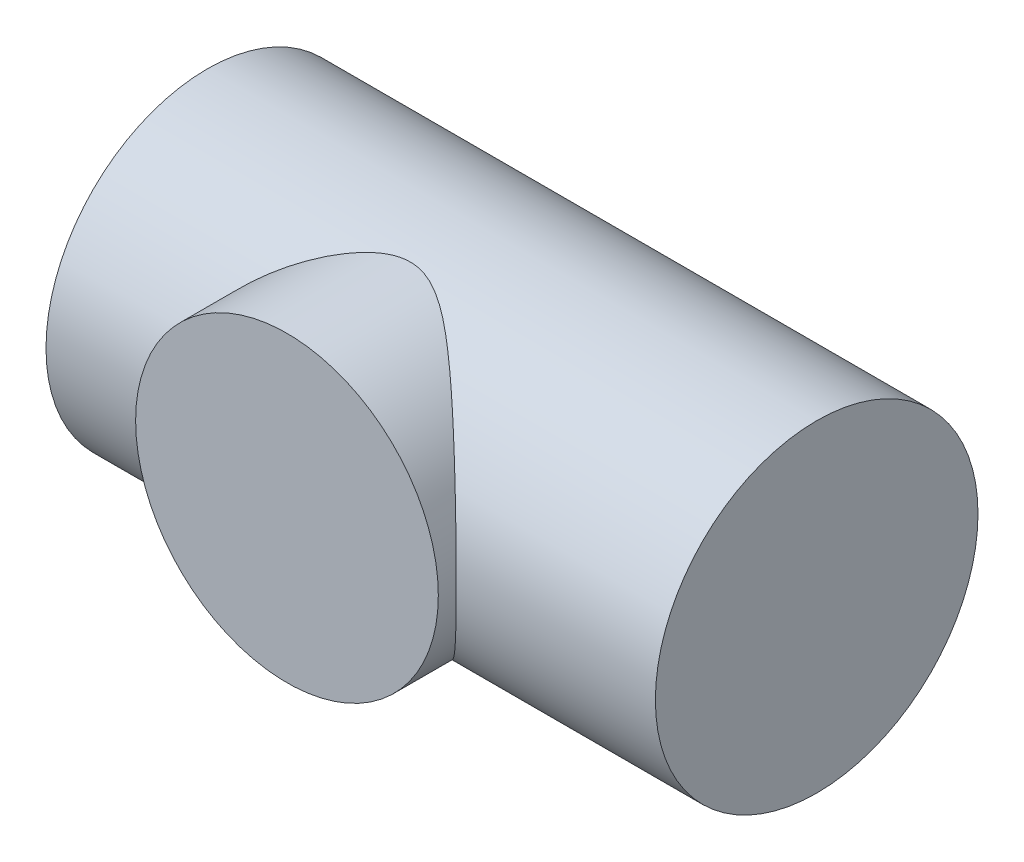
ISO-10303-21;
HEADER;
FILE_DESCRIPTION(('STEP AP214'),'2;1');
FILE_NAME('part.step','',(''),(''),'','','');
FILE_SCHEMA(('AUTOMOTIVE_DESIGN { 1 0 10303 214 1 1 1 1 }'));
ENDSEC;
DATA;
#1=APPLICATION_CONTEXT('core data for automotive mechanical design processes');
#2=APPLICATION_PROTOCOL_DEFINITION('international standard','automotive_design',2000,#1);
#3=PRODUCT_CONTEXT('',#1,'mechanical');
#4=PRODUCT('Part','Part','',(#3));
#5=PRODUCT_RELATED_PRODUCT_CATEGORY('part','',(#4));
#6=PRODUCT_DEFINITION_FORMATION('','',#4);
#7=PRODUCT_DEFINITION_CONTEXT('part definition',#1,'design');
#8=PRODUCT_DEFINITION('design','',#6,#7);
#9=PRODUCT_DEFINITION_SHAPE('','',#8);
#10=(LENGTH_UNIT() NAMED_UNIT(*) SI_UNIT(.MILLI.,.METRE.));
#11=(NAMED_UNIT(*) PLANE_ANGLE_UNIT() SI_UNIT($,.RADIAN.));
#12=(NAMED_UNIT(*) SI_UNIT($,.STERADIAN.) SOLID_ANGLE_UNIT());
#13=UNCERTAINTY_MEASURE_WITH_UNIT(LENGTH_MEASURE(1.E-05),#10,'distance_accuracy_value','');
#14=(GEOMETRIC_REPRESENTATION_CONTEXT(3) GLOBAL_UNCERTAINTY_ASSIGNED_CONTEXT((#13)) GLOBAL_UNIT_ASSIGNED_CONTEXT((#10,
#11,#12)) REPRESENTATION_CONTEXT('',''));
#15=CARTESIAN_POINT('',(0.,0.,0.));
#16=DIRECTION('',(0.,0.,1.));
#17=DIRECTION('',(1.,0.,0.));
#18=AXIS2_PLACEMENT_3D('',#15,#16,#17);
#19=CARTESIAN_POINT('',(0.088,0.,0.));
#20=DIRECTION('',(-1.,0.,0.));
#21=DIRECTION('',(0.,0.,1.));
#22=AXIS2_PLACEMENT_3D('',#19,#20,#21);
#23=CYLINDRICAL_SURFACE('',#22,0.0405);
#24=CARTESIAN_POINT('',(0.088,0.,0.));
#25=DIRECTION('',(1.,0.,0.));
#26=DIRECTION('',(0.,0.,-1.));
#27=AXIS2_PLACEMENT_3D('',#24,#25,#26);
#28=CIRCLE('',#27,0.0405);
#29=CARTESIAN_POINT('',(0.088,0.,-0.0405));
#30=VERTEX_POINT('',#29);
#31=EDGE_CURVE('E44',#30,#30,#28,.T.);
#32=ORIENTED_EDGE('',*,*,#31,.F.);
#33=EDGE_LOOP('',(#32));
#34=FACE_BOUND('',#33,.T.);
#35=CARTESIAN_POINT('',(-0.065,0.,0.));
#36=DIRECTION('',(1.,0.,0.));
#37=DIRECTION('',(0.,0.,-1.));
#38=AXIS2_PLACEMENT_3D('',#35,#36,#37);
#39=CIRCLE('',#38,0.0405);
#40=CARTESIAN_POINT('',(-0.065,0.,-0.0405));
#41=VERTEX_POINT('',#40);
#42=EDGE_CURVE('E48',#41,#41,#39,.T.);
#43=ORIENTED_EDGE('',*,*,#42,.T.);
#44=EDGE_LOOP('',(#43));
#45=FACE_BOUND('',#44,.T.);
#46=CARTESIAN_POINT('',(0.038,0.,0.0405));
#47=CARTESIAN_POINT('',(0.0379998436056929,0.00173464531378994,0.040499844851322));
#48=CARTESIAN_POINT('',(0.0378801601071881,0.00347117666066099,0.040387492347376));
#49=CARTESIAN_POINT('',(0.0374108064132313,0.00688596600961166,0.0399476160504583));
#50=CARTESIAN_POINT('',(0.0370607339762275,0.00856411667838719,0.0396197159289107));
#51=CARTESIAN_POINT('',(0.036159543315923,0.0118023042819811,0.0387780455508259));
#52=CARTESIAN_POINT('',(0.0356097875673089,0.0133630571319026,0.0382655351153598));
#53=CARTESIAN_POINT('',(0.0343410122253715,0.0163503339420385,0.037087728867139));
#54=CARTESIAN_POINT('',(0.0336219835968048,0.0177768507314715,0.0364224248988021));
#55=CARTESIAN_POINT('',(0.0317248797975061,0.0210328242274146,0.0346774764992745));
#56=CARTESIAN_POINT('',(0.0304788743861143,0.0227912134517076,0.0335391960272855));
#57=CARTESIAN_POINT('',(0.0277767955693511,0.0260173627252535,0.031103847065006));
#58=CARTESIAN_POINT('',(0.0263200373775349,0.0274841368639557,0.0298062631247067));
#59=CARTESIAN_POINT('',(0.0228192002680085,0.0304955650312954,0.0267589667813905));
#60=CARTESIAN_POINT('',(0.0207233838048813,0.0319520579169702,0.0249825682394132));
#61=CARTESIAN_POINT('',(0.0162862155182044,0.0344278271964056,0.021436302920104));
#62=CARTESIAN_POINT('',(0.013945589038381,0.0354483520551457,0.0196664320772224));
#63=CARTESIAN_POINT('',(0.0105433917269998,0.0365193449985406,0.0175211689946979));
#64=CARTESIAN_POINT('',(0.00964350189634389,0.0367683356018215,0.0169892730804365));
#65=CARTESIAN_POINT('',(0.00778538189350438,0.0372062141039362,0.0160071815891125));
#66=CARTESIAN_POINT('',(0.00682721569936953,0.0373951665450588,0.0155568985018543));
#67=CARTESIAN_POINT('',(0.00505242146494678,0.0376709355540498,0.0148747683780991));
#68=CARTESIAN_POINT('',(0.00424818581218965,0.0377708555757698,0.0146169231175633));
#69=CARTESIAN_POINT('',(0.0026060377902294,0.0379194320687773,0.0142271464964703));
#70=CARTESIAN_POINT('',(0.00176824154176504,0.0379682517165418,0.014094814468117));
#71=CARTESIAN_POINT('',(7.34400959768043E-05,0.0380094306730602,0.0139835010880618));
#72=CARTESIAN_POINT('',(-0.000783666202818941,0.0380013245443666,0.0140057838828856));
#73=CARTESIAN_POINT('',(-0.00247858386331989,0.0379286283222337,0.0142013472989969));
#74=CARTESIAN_POINT('',(-0.00331634644910776,0.0378639086902755,0.0143749742106461));
#75=CARTESIAN_POINT('',(-0.00528153311789406,0.037648930363841,0.0149306209188899));
#76=CARTESIAN_POINT('',(-0.00638979849927784,0.037474725037118,0.0153683946073894));
#77=CARTESIAN_POINT('',(-0.00852987527014205,0.0370464357510433,0.0163742708518775));
#78=CARTESIAN_POINT('',(-0.00956132289137632,0.0367919983285627,0.0169429470474666));
#79=CARTESIAN_POINT('',(-0.012764817395923,0.0358657301059859,0.0188683842936335));
#80=CARTESIAN_POINT('',(-0.0148203966748624,0.0350594029746342,0.0203519957268335));
#81=CARTESIAN_POINT('',(-0.018738203877804,0.0331301867919089,0.0233650510761002));
#82=CARTESIAN_POINT('',(-0.0206000265841243,0.0320066518529874,0.024894582755017));
#83=CARTESIAN_POINT('',(-0.0243216583551498,0.02929664491447,0.0280482725312566));
#84=CARTESIAN_POINT('',(-0.0261615271747433,0.027674421535567,0.029665961346696));
#85=CARTESIAN_POINT('',(-0.0295598192082068,0.0240085728598991,0.0327028470233565));
#86=CARTESIAN_POINT('',(-0.0311192496817641,0.0219665145594467,0.0341227499593188));
#87=CARTESIAN_POINT('',(-0.0333428975755379,0.0183025069092472,0.0361646996554999));
#88=CARTESIAN_POINT('',(-0.0341242193533203,0.0168073400369658,0.0368869452042288));
#89=CARTESIAN_POINT('',(-0.035499315322221,0.0136649987005813,0.0381626156313617));
#90=CARTESIAN_POINT('',(-0.0360932108718662,0.0120179234937817,0.0387161497424827));
#91=CARTESIAN_POINT('',(-0.0370597789759407,0.00858887721255524,0.0396187717253637));
#92=CARTESIAN_POINT('',(-0.0374305215494522,0.00680587544073879,0.039966075638768));
#93=CARTESIAN_POINT('',(-0.0379112455369211,0.00317501373676711,0.0404166455676535));
#94=CARTESIAN_POINT('',(-0.0380214451199571,0.0013272093847918,0.0405201157602506));
#95=CARTESIAN_POINT('',(-0.0379746836313138,-0.0021275320572406,0.0404762512862704));
#96=CARTESIAN_POINT('',(-0.0378496726955111,-0.00373544749476317,0.0403589104694561));
#97=CARTESIAN_POINT('',(-0.0374026709334864,-0.00689868521367364,0.039940001240082));
#98=CARTESIAN_POINT('',(-0.0370806565095411,-0.00845400117096775,0.0396384107574997));
#99=CARTESIAN_POINT('',(-0.0362621139337757,-0.0114667932231444,0.0388737664842229));
#100=CARTESIAN_POINT('',(-0.0357664277735781,-0.0129247016702829,0.038411491803294));
#101=CARTESIAN_POINT('',(-0.0346257327372598,-0.0157274141540591,0.0373516671909871));
#102=CARTESIAN_POINT('',(-0.0339806840414787,-0.0170721878987108,0.0367540811869068));
#103=CARTESIAN_POINT('',(-0.0322272987851345,-0.0202506301929906,0.0351380522163006));
#104=CARTESIAN_POINT('',(-0.031044895998046,-0.0220107204405863,0.0340549804892491));
#105=CARTESIAN_POINT('',(-0.0284711795384096,-0.0252527635332221,0.0317261961547149));
#106=CARTESIAN_POINT('',(-0.0270791861697006,-0.0267337747941629,0.0304799561786531));
#107=CARTESIAN_POINT('',(-0.0236867791748801,-0.0298275200737866,0.0275040077165069));
#108=CARTESIAN_POINT('',(-0.0216293819042772,-0.0313456062202574,0.0257417263007909));
#109=CARTESIAN_POINT('',(-0.017273004065403,-0.0339430150418685,0.0221998677709588));
#110=CARTESIAN_POINT('',(-0.014974621503949,-0.0350233929086673,0.0204203429692685));
#111=CARTESIAN_POINT('',(-0.0116236276908417,-0.0361904476551091,0.0181922993200655));
#112=CARTESIAN_POINT('',(-0.0107180926788709,-0.0364698913023493,0.0176224795200082));
#113=CARTESIAN_POINT('',(-0.0088495651761471,-0.0369678835001789,0.016551973625334));
#114=CARTESIAN_POINT('',(-0.00788658580629431,-0.0371864458925196,0.0160512718293669));
#115=CARTESIAN_POINT('',(-0.00606349737039648,-0.0375224970445427,0.015246967802752));
#116=CARTESIAN_POINT('',(-0.00521410675695181,-0.0376508957955612,0.0149242856182139));
#117=CARTESIAN_POINT('',(-0.00347101895677904,-0.0378512143254515,0.01440882452877));
#118=CARTESIAN_POINT('',(-0.00257748793068342,-0.0379233309626051,0.0142155931818689));
#119=CARTESIAN_POINT('',(-0.000899069781867416,-0.0379972290897892,0.0140168094371382));
#120=CARTESIAN_POINT('',(-0.000117459801413851,-0.0380077721222147,0.0139878953257807));
#121=CARTESIAN_POINT('',(0.00143870974655623,-0.0379807421411533,0.0140610961088984));
#122=CARTESIAN_POINT('',(0.00221326566516703,-0.0379431455080157,0.014163275324156));
#123=CARTESIAN_POINT('',(0.00399761897646041,-0.0378031114568934,0.0145335268090859));
#124=CARTESIAN_POINT('',(0.00499626102784804,-0.0376827630521208,0.01484670918049));
#125=CARTESIAN_POINT('',(0.00693271472852449,-0.0373752118200854,0.0156048987800983));
#126=CARTESIAN_POINT('',(0.00787020682320517,-0.0371876866143991,0.0160505398847274));
#127=CARTESIAN_POINT('',(0.0107024274257384,-0.0365155222439415,0.017552299176666));
#128=CARTESIAN_POINT('',(0.0125037072674675,-0.0359322315751432,0.0187366700765291));
#129=CARTESIAN_POINT('',(0.0159478776282211,-0.0345412188916462,0.021194433216994));
#130=CARTESIAN_POINT('',(0.0175904190133585,-0.033733016684586,0.0224680115153336));
#131=CARTESIAN_POINT('',(0.0210061113933889,-0.0317375760657486,0.0252254545074965));
#132=CARTESIAN_POINT('',(0.0227560758616469,-0.0305097948215194,0.0267093336281168));
#133=CARTESIAN_POINT('',(0.0260670009022576,-0.0277337222509548,0.0295818088605094));
#134=CARTESIAN_POINT('',(0.0276282773315013,-0.0261859786441789,0.0309705624715789));
#135=CARTESIAN_POINT('',(0.0302202960503025,-0.0231065501898503,0.0333057134225781));
#136=CARTESIAN_POINT('',(0.0312942631624432,-0.0216361734329283,0.034284522020982));
#137=CARTESIAN_POINT('',(0.0332530901822007,-0.0184841355606838,0.0360813846793193));
#138=CARTESIAN_POINT('',(0.0341381084758648,-0.0168026532970032,0.0368995733319835));
#139=CARTESIAN_POINT('',(0.0355362171004626,-0.0135551885499925,0.0381970908476148));
#140=CARTESIAN_POINT('',(0.0360871160149312,-0.0120192184963438,0.0387105147602347));
#141=CARTESIAN_POINT('',(0.0369930473419839,-0.00884438103294297,0.0395564021264806));
#142=CARTESIAN_POINT('',(0.0373485038632052,-0.00720574509041766,0.0398892573916504));
#143=CARTESIAN_POINT('',(0.0377285264046943,-0.00462714721674122,0.040245369847636));
#144=CARTESIAN_POINT('',(0.0378300492329893,-0.00370752525458374,0.0403405757731367));
#145=CARTESIAN_POINT('',(0.0379658358732394,-0.00185878422905319,0.0404679398613755));
#146=CARTESIAN_POINT('',(0.0380000838177096,-0.000929662977104747,0.0405000831501291));
#147=CARTESIAN_POINT('',(0.038,0.,0.0405));
#148=B_SPLINE_CURVE_WITH_KNOTS('',3,(#46,#47,#48,#49,#50,#51,#52,#53,#54,#55,#56,#57,#58,#59,
#60,#61,#62,#63,#64,#65,#66,#67,#68,#69,#70,#71,#72,#73,#74,#75,#76,#77,#78,#79,#80,#81,#82,#83,
#84,#85,#86,#87,#88,#89,#90,#91,#92,#93,#94,#95,#96,#97,#98,#99,#100,#101,#102,#103,#104,#105,
#106,#107,#108,#109,#110,#111,#112,#113,#114,#115,#116,#117,#118,#119,#120,#121,#122,#123,#124,
#125,#126,#127,#128,#129,#130,#131,#132,#133,#134,#135,#136,#137,#138,#139,#140,#141,#142,#143,
#144,#145,#146,#147),.UNSPECIFIED.,.T.,.F.,(4,2,2,2,2,2,2,2,2,2,2,2,2,2,2,2,2,2,2,2,2,2,2,2,2,2,
2,2,2,2,2,2,2,2,2,2,2,2,2,2,2,2,2,2,2,2,2,2,2,2,4),(0.,0.00519981418163482,0.0104087310135126,
0.0155827543520424,0.0207570539259807,0.0280288256574288,0.0353247791195297,0.0446135886177117,
0.0538756168372805,0.0570955884751765,0.0603120867715354,0.06285484653181,0.0653894616102888,
0.06794482423679,0.070506049180305,0.0740983314327379,0.0777066659774063,0.0856447374444392,
0.0935990901734417,0.102372344253517,0.1111134288028,0.116599057059075,0.122081126047309,
0.127609950837716,0.133134144352191,0.137961425869105,0.142789285726857,0.147594055950481,
0.152400108591067,0.159503519147219,0.166630482817952,0.175903743885659,0.185154514768757,
0.188468727936754,0.191782186980561,0.19452684446314,0.197261858371644,0.199595902068203,
0.20193109139856,0.205072873246255,0.208229938910363,0.214893865478994,0.221572130336808,
0.229352615996109,0.237119891505153,0.243300458641066,0.249475824406213,0.254587249323232,
0.259687538262536,0.262473661127318,0.26526044104945),.UNSPECIFIED.);
#149=CARTESIAN_POINT('',(0.038,0.,0.0405));
#150=VERTEX_POINT('',#149);
#151=EDGE_CURVE('E10',#150,#150,#148,.T.);
#152=ORIENTED_EDGE('',*,*,#151,.F.);
#153=EDGE_LOOP('',(#152));
#154=FACE_BOUND('',#153,.T.);
#155=ADVANCED_FACE('F33',(#34,#45,#154),#23,.T.);
#156=CARTESIAN_POINT('',(0.088,0.,0.));
#157=DIRECTION('',(1.,0.,0.));
#158=DIRECTION('',(0.,0.,-1.));
#159=AXIS2_PLACEMENT_3D('',#156,#157,#158);
#160=PLANE('',#159);
#161=ORIENTED_EDGE('',*,*,#31,.T.);
#162=EDGE_LOOP('',(#161));
#163=FACE_BOUND('',#162,.T.);
#164=ADVANCED_FACE('F68',(#163),#160,.T.);
#165=CARTESIAN_POINT('',(-0.065,0.,0.));
#166=DIRECTION('',(1.,0.,0.));
#167=DIRECTION('',(0.,0.,-1.));
#168=AXIS2_PLACEMENT_3D('',#165,#166,#167);
#169=PLANE('',#168);
#170=ORIENTED_EDGE('',*,*,#42,.F.);
#171=EDGE_LOOP('',(#170));
#172=FACE_BOUND('',#171,.T.);
#173=ADVANCED_FACE('F62',(#172),#169,.F.);
#174=CARTESIAN_POINT('',(0.,0.,0.045));
#175=DIRECTION('',(0.,0.,-1.));
#176=DIRECTION('',(-1.,0.,0.));
#177=AXIS2_PLACEMENT_3D('',#174,#175,#176);
#178=CYLINDRICAL_SURFACE('',#177,0.038);
#179=CARTESIAN_POINT('',(0.,0.,0.045));
#180=DIRECTION('',(0.,0.,1.));
#181=DIRECTION('',(1.,0.,0.));
#182=AXIS2_PLACEMENT_3D('',#179,#180,#181);
#183=CIRCLE('',#182,0.038);
#184=CARTESIAN_POINT('',(0.038,0.,0.045));
#185=VERTEX_POINT('',#184);
#186=EDGE_CURVE('E53',#185,#185,#183,.T.);
#187=ORIENTED_EDGE('',*,*,#186,.F.);
#188=EDGE_LOOP('',(#187));
#189=FACE_BOUND('',#188,.T.);
#190=ORIENTED_EDGE('',*,*,#151,.T.);
#191=EDGE_LOOP('',(#190));
#192=FACE_BOUND('',#191,.T.);
#193=ADVANCED_FACE('F60',(#189,#192),#178,.T.);
#194=CARTESIAN_POINT('',(0.,0.,0.045));
#195=DIRECTION('',(0.,0.,1.));
#196=DIRECTION('',(1.,0.,0.));
#197=AXIS2_PLACEMENT_3D('',#194,#195,#196);
#198=PLANE('',#197);
#199=ORIENTED_EDGE('',*,*,#186,.T.);
#200=EDGE_LOOP('',(#199));
#201=FACE_BOUND('',#200,.T.);
#202=ADVANCED_FACE('F58',(#201),#198,.T.);
#203=CLOSED_SHELL('',(#155,#164,#173,#193,#202));
#204=MANIFOLD_SOLID_BREP('B2',#203);
#205=ADVANCED_BREP_SHAPE_REPRESENTATION('',(#18,#204),#14);
#206=SHAPE_DEFINITION_REPRESENTATION(#9,#205);
ENDSEC;
END-ISO-10303-21;
